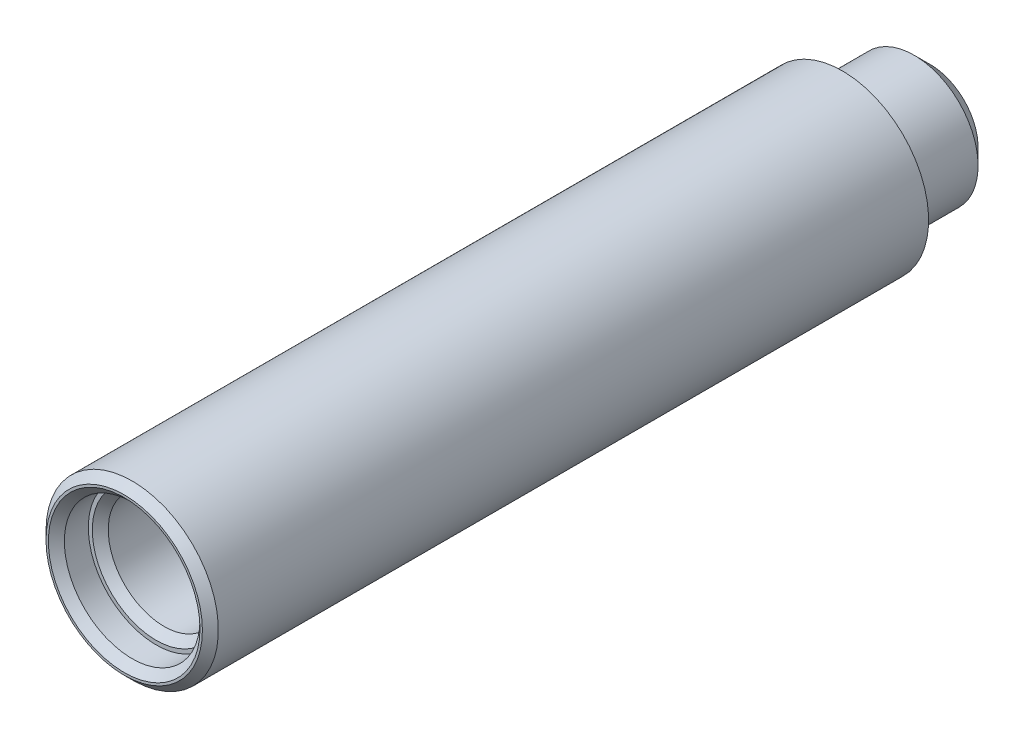
ISO-10303-21;
HEADER;
FILE_DESCRIPTION(('STEP AP214'),'2;1');
FILE_NAME('part.step','',(''),(''),'','','');
FILE_SCHEMA(('AUTOMOTIVE_DESIGN { 1 0 10303 214 1 1 1 1 }'));
ENDSEC;
DATA;
#1=APPLICATION_CONTEXT('core data for automotive mechanical design processes');
#2=APPLICATION_PROTOCOL_DEFINITION('international standard','automotive_design',2000,#1);
#3=PRODUCT_CONTEXT('',#1,'mechanical');
#4=PRODUCT('Part','Part','',(#3));
#5=PRODUCT_RELATED_PRODUCT_CATEGORY('part','',(#4));
#6=PRODUCT_DEFINITION_FORMATION('','',#4);
#7=PRODUCT_DEFINITION_CONTEXT('part definition',#1,'design');
#8=PRODUCT_DEFINITION('design','',#6,#7);
#9=PRODUCT_DEFINITION_SHAPE('','',#8);
#10=(LENGTH_UNIT() NAMED_UNIT(*) SI_UNIT(.MILLI.,.METRE.));
#11=(NAMED_UNIT(*) PLANE_ANGLE_UNIT() SI_UNIT($,.RADIAN.));
#12=(NAMED_UNIT(*) SI_UNIT($,.STERADIAN.) SOLID_ANGLE_UNIT());
#13=UNCERTAINTY_MEASURE_WITH_UNIT(LENGTH_MEASURE(1.E-05),#10,'distance_accuracy_value','');
#14=(GEOMETRIC_REPRESENTATION_CONTEXT(3) GLOBAL_UNCERTAINTY_ASSIGNED_CONTEXT((#13)) GLOBAL_UNIT_ASSIGNED_CONTEXT((#10,
#11,#12)) REPRESENTATION_CONTEXT('',''));
#15=CARTESIAN_POINT('',(0.,0.,0.));
#16=DIRECTION('',(0.,0.,1.));
#17=DIRECTION('',(1.,0.,0.));
#18=AXIS2_PLACEMENT_3D('',#15,#16,#17);
#19=CARTESIAN_POINT('',(0.,0.,0.));
#20=DIRECTION('',(0.,0.,1.));
#21=DIRECTION('',(1.,0.,0.));
#22=AXIS2_PLACEMENT_3D('',#19,#20,#21);
#23=PLANE('',#22);
#24=CARTESIAN_POINT('',(0.,0.,0.));
#25=DIRECTION('',(0.,0.,1.));
#26=DIRECTION('',(1.,0.,0.));
#27=AXIS2_PLACEMENT_3D('',#24,#25,#26);
#28=CIRCLE('',#27,5.4);
#29=CARTESIAN_POINT('',(-5.4,0.,0.));
#30=VERTEX_POINT('',#29);
#31=EDGE_CURVE('E58',#30,#30,#28,.T.);
#32=ORIENTED_EDGE('',*,*,#31,.F.);
#33=EDGE_LOOP('',(#32));
#34=FACE_BOUND('',#33,.T.);
#35=CARTESIAN_POINT('',(0.,0.,0.));
#36=DIRECTION('',(0.,0.,1.));
#37=DIRECTION('',(1.,0.,0.));
#38=AXIS2_PLACEMENT_3D('',#35,#36,#37);
#39=CIRCLE('',#38,3.5);
#40=CARTESIAN_POINT('',(3.5,0.,0.));
#41=VERTEX_POINT('',#40);
#42=EDGE_CURVE('E86',#41,#41,#39,.F.);
#43=ORIENTED_EDGE('',*,*,#42,.F.);
#44=EDGE_LOOP('',(#43));
#45=FACE_BOUND('',#44,.T.);
#46=ADVANCED_FACE('F38',(#34,#45),#23,.F.);
#47=CARTESIAN_POINT('',(0.,0.,45.));
#48=DIRECTION('',(0.,0.,-1.));
#49=DIRECTION('',(-1.,0.,0.));
#50=AXIS2_PLACEMENT_3D('',#47,#48,#49);
#51=CYLINDRICAL_SURFACE('',#50,5.4);
#52=CARTESIAN_POINT('',(0.,0.,44.5));
#53=DIRECTION('',(0.,0.,1.));
#54=DIRECTION('',(1.,0.,0.));
#55=AXIS2_PLACEMENT_3D('',#52,#53,#54);
#56=CIRCLE('',#55,5.4);
#57=CARTESIAN_POINT('',(-5.4,0.,44.5));
#58=VERTEX_POINT('',#57);
#59=EDGE_CURVE('E71',#58,#58,#56,.F.);
#60=CARTESIAN_POINT('',(-5.4,0.,44.5));
#61=CARTESIAN_POINT('',(-5.4,0.,44.0364583333334));
#62=CARTESIAN_POINT('',(-5.4,0.,43.5729166666667));
#63=CARTESIAN_POINT('',(-5.4,0.,42.6458333333334));
#64=CARTESIAN_POINT('',(-5.4,0.,42.1822916666667));
#65=CARTESIAN_POINT('',(-5.4,0.,41.2552083333334));
#66=CARTESIAN_POINT('',(-5.4,0.,40.7916666666667));
#67=CARTESIAN_POINT('',(-5.4,0.,39.8645833333334));
#68=CARTESIAN_POINT('',(-5.4,0.,39.4010416666667));
#69=CARTESIAN_POINT('',(-5.4,0.,38.4739583333334));
#70=CARTESIAN_POINT('',(-5.4,0.,38.0104166666667));
#71=CARTESIAN_POINT('',(-5.4,0.,37.0833333333334));
#72=CARTESIAN_POINT('',(-5.4,0.,36.6197916666667));
#73=CARTESIAN_POINT('',(-5.4,0.,35.6927083333334));
#74=CARTESIAN_POINT('',(-5.4,0.,35.2291666666667));
#75=CARTESIAN_POINT('',(-5.4,0.,34.3020833333334));
#76=CARTESIAN_POINT('',(-5.4,0.,33.8385416666667));
#77=CARTESIAN_POINT('',(-5.4,0.,32.9114583333334));
#78=CARTESIAN_POINT('',(-5.4,0.,32.4479166666667));
#79=CARTESIAN_POINT('',(-5.4,0.,31.5208333333334));
#80=CARTESIAN_POINT('',(-5.4,0.,31.0572916666667));
#81=CARTESIAN_POINT('',(-5.4,0.,30.1302083333334));
#82=CARTESIAN_POINT('',(-5.4,0.,29.6666666666667));
#83=CARTESIAN_POINT('',(-5.4,0.,28.7395833333334));
#84=CARTESIAN_POINT('',(-5.4,0.,28.2760416666667));
#85=CARTESIAN_POINT('',(-5.4,0.,27.3489583333334));
#86=CARTESIAN_POINT('',(-5.4,0.,26.8854166666667));
#87=CARTESIAN_POINT('',(-5.4,0.,25.9583333333334));
#88=CARTESIAN_POINT('',(-5.4,0.,25.4947916666667));
#89=CARTESIAN_POINT('',(-5.4,0.,24.5677083333334));
#90=CARTESIAN_POINT('',(-5.4,0.,24.1041666666667));
#91=CARTESIAN_POINT('',(-5.4,0.,23.1770833333334));
#92=CARTESIAN_POINT('',(-5.4,0.,22.7135416666667));
#93=CARTESIAN_POINT('',(-5.4,0.,21.7864583333334));
#94=CARTESIAN_POINT('',(-5.4,0.,21.3229166666667));
#95=CARTESIAN_POINT('',(-5.4,0.,20.3958333333333));
#96=CARTESIAN_POINT('',(-5.4,0.,19.9322916666667));
#97=CARTESIAN_POINT('',(-5.4,0.,19.0052083333333));
#98=CARTESIAN_POINT('',(-5.4,0.,18.5416666666667));
#99=CARTESIAN_POINT('',(-5.4,0.,17.6145833333333));
#100=CARTESIAN_POINT('',(-5.4,0.,17.1510416666667));
#101=CARTESIAN_POINT('',(-5.4,0.,16.2239583333333));
#102=CARTESIAN_POINT('',(-5.4,0.,15.7604166666667));
#103=CARTESIAN_POINT('',(-5.4,0.,14.8333333333333));
#104=CARTESIAN_POINT('',(-5.4,0.,14.3697916666667));
#105=CARTESIAN_POINT('',(-5.4,0.,13.4427083333333));
#106=CARTESIAN_POINT('',(-5.4,0.,12.9791666666667));
#107=CARTESIAN_POINT('',(-5.4,0.,12.0520833333333));
#108=CARTESIAN_POINT('',(-5.4,0.,11.5885416666667));
#109=CARTESIAN_POINT('',(-5.4,0.,10.6614583333333));
#110=CARTESIAN_POINT('',(-5.4,0.,10.1979166666667));
#111=CARTESIAN_POINT('',(-5.4,0.,9.27083333333334));
#112=CARTESIAN_POINT('',(-5.4,0.,8.80729166666667));
#113=CARTESIAN_POINT('',(-5.4,0.,7.88020833333334));
#114=CARTESIAN_POINT('',(-5.4,0.,7.41666666666668));
#115=CARTESIAN_POINT('',(-5.4,0.,6.48958333333334));
#116=CARTESIAN_POINT('',(-5.4,0.,6.02604166666667));
#117=CARTESIAN_POINT('',(-5.4,0.,5.09895833333334));
#118=CARTESIAN_POINT('',(-5.4,0.,4.63541666666667));
#119=CARTESIAN_POINT('',(-5.4,0.,3.70833333333333));
#120=CARTESIAN_POINT('',(-5.4,0.,3.24479166666667));
#121=CARTESIAN_POINT('',(-5.4,0.,2.31770833333334));
#122=CARTESIAN_POINT('',(-5.4,0.,1.85416666666667));
#123=CARTESIAN_POINT('',(-5.4,0.,0.927083333333331));
#124=CARTESIAN_POINT('',(-5.4,0.,0.463541666666661));
#125=CARTESIAN_POINT('',(-5.4,0.,0.));
#126=B_SPLINE_CURVE_WITH_KNOTS('',3,(#60,#61,#62,#63,#64,#65,#66,#67,#68,#69,#70,#71,#72,#73,
#74,#75,#76,#77,#78,#79,#80,#81,#82,#83,#84,#85,#86,#87,#88,#89,#90,#91,#92,#93,#94,#95,#96,#97,
#98,#99,#100,#101,#102,#103,#104,#105,#106,#107,#108,#109,#110,#111,#112,#113,#114,#115,#116,
#117,#118,#119,#120,#121,#122,#123,#124,#125),.UNSPECIFIED.,.F.,.F.,(4,2,2,2,2,2,2,2,2,2,2,2,2,
2,2,2,2,2,2,2,2,2,2,2,2,2,2,2,2,2,2,2,4),(0.,1.39062500000001,2.78125000000001,4.17187500000001,
5.56250000000001,6.95312500000001,8.34375000000001,9.73437500000001,11.125,12.515625,13.90625,
15.296875,16.6875,18.078125,19.46875,20.859375,22.25,23.640625,25.03125,26.421875,27.8125,
29.203125,30.59375,31.984375,33.375,34.765625,36.15625,37.546875,38.9375,40.328125,41.71875,
43.109375,44.5000000000001),.UNSPECIFIED.);
#127=EDGE_CURVE('BSEAM102',#58,#30,#126,.T.);
#128=ORIENTED_EDGE('',*,*,#59,.T.);
#129=ORIENTED_EDGE('',*,*,#31,.T.);
#130=ORIENTED_EDGE('',*,*,#127,.T.);
#131=ORIENTED_EDGE('',*,*,#127,.F.);
#132=EDGE_LOOP('',(#128,#130,#129,#131));
#133=FACE_BOUND('',#132,.T.);
#134=ADVANCED_FACE('F102',(#133),#51,.T.);
#135=CARTESIAN_POINT('',(0.,0.,45.));
#136=DIRECTION('',(0.,0.,1.));
#137=DIRECTION('',(1.,0.,0.));
#138=AXIS2_PLACEMENT_3D('',#135,#136,#137);
#139=PLANE('',#138);
#140=CARTESIAN_POINT('',(0.,0.,45.));
#141=DIRECTION('',(0.,0.,1.));
#142=DIRECTION('',(1.,0.,0.));
#143=AXIS2_PLACEMENT_3D('',#140,#141,#142);
#144=CIRCLE('',#143,4.75);
#145=CARTESIAN_POINT('',(4.74999999999999,0.,45.));
#146=VERTEX_POINT('',#145);
#147=EDGE_CURVE('E77',#146,#146,#144,.F.);
#148=ORIENTED_EDGE('',*,*,#147,.T.);
#149=EDGE_LOOP('',(#148));
#150=FACE_BOUND('',#149,.T.);
#151=CARTESIAN_POINT('',(0.,0.,45.));
#152=DIRECTION('',(0.,0.,1.));
#153=DIRECTION('',(1.,0.,0.));
#154=AXIS2_PLACEMENT_3D('',#151,#152,#153);
#155=CIRCLE('',#154,4.90000000000004);
#156=CARTESIAN_POINT('',(4.90000000000004,0.,45.));
#157=VERTEX_POINT('',#156);
#158=EDGE_CURVE('E62',#157,#157,#155,.T.);
#159=ORIENTED_EDGE('',*,*,#158,.T.);
#160=EDGE_LOOP('',(#159));
#161=FACE_BOUND('',#160,.T.);
#162=ADVANCED_FACE('F108',(#150,#161),#139,.T.);
#163=CARTESIAN_POINT('',(0.,0.,45.));
#164=DIRECTION('',(0.,0.,-1.));
#165=DIRECTION('',(-1.,0.,0.));
#166=AXIS2_PLACEMENT_3D('',#163,#164,#165);
#167=CONICAL_SURFACE('',#166,4.90000000000004,0.785398163397454);
#168=ORIENTED_EDGE('',*,*,#59,.F.);
#169=EDGE_LOOP('',(#168));
#170=FACE_BOUND('',#169,.T.);
#171=ORIENTED_EDGE('',*,*,#158,.F.);
#172=EDGE_LOOP('',(#171));
#173=FACE_BOUND('',#172,.T.);
#174=ADVANCED_FACE('F120',(#170,#173),#167,.T.);
#175=CARTESIAN_POINT('',(0.,0.,43.));
#176=DIRECTION('',(0.,0.,1.));
#177=DIRECTION('',(1.,0.,0.));
#178=AXIS2_PLACEMENT_3D('',#175,#176,#177);
#179=PLANE('',#178);
#180=CARTESIAN_POINT('',(0.,0.,43.));
#181=DIRECTION('',(0.,0.,1.));
#182=DIRECTION('',(1.,0.,0.));
#183=AXIS2_PLACEMENT_3D('',#180,#181,#182);
#184=CIRCLE('',#183,3.99999999999998);
#185=CARTESIAN_POINT('',(3.99999999999998,0.,43.));
#186=VERTEX_POINT('',#185);
#187=EDGE_CURVE('E80',#186,#186,#184,.F.);
#188=ORIENTED_EDGE('',*,*,#187,.T.);
#189=EDGE_LOOP('',(#188));
#190=FACE_BOUND('',#189,.T.);
#191=CARTESIAN_POINT('',(0.,0.,43.));
#192=DIRECTION('',(0.,0.,1.));
#193=DIRECTION('',(1.,0.,0.));
#194=AXIS2_PLACEMENT_3D('',#191,#192,#193);
#195=CIRCLE('',#194,4.25);
#196=CARTESIAN_POINT('',(4.25,0.,43.));
#197=VERTEX_POINT('',#196);
#198=EDGE_CURVE('E59',#197,#197,#195,.T.);
#199=ORIENTED_EDGE('',*,*,#198,.T.);
#200=EDGE_LOOP('',(#199));
#201=FACE_BOUND('',#200,.T.);
#202=ADVANCED_FACE('F117',(#190,#201),#179,.T.);
#203=CARTESIAN_POINT('',(0.,0.,43.));
#204=DIRECTION('',(0.,0.,1.));
#205=DIRECTION('',(1.,0.,0.));
#206=AXIS2_PLACEMENT_3D('',#203,#204,#205);
#207=CYLINDRICAL_SURFACE('',#206,4.25);
#208=CARTESIAN_POINT('',(0.,0.,44.5));
#209=DIRECTION('',(0.,0.,1.));
#210=DIRECTION('',(1.,0.,0.));
#211=AXIS2_PLACEMENT_3D('',#208,#209,#210);
#212=CIRCLE('',#211,4.25);
#213=CARTESIAN_POINT('',(4.25,0.,44.5));
#214=VERTEX_POINT('',#213);
#215=EDGE_CURVE('E74',#214,#214,#212,.T.);
#216=ORIENTED_EDGE('',*,*,#215,.T.);
#217=EDGE_LOOP('',(#216));
#218=FACE_BOUND('',#217,.T.);
#219=ORIENTED_EDGE('',*,*,#198,.F.);
#220=EDGE_LOOP('',(#219));
#221=FACE_BOUND('',#220,.T.);
#222=ADVANCED_FACE('F52',(#218,#221),#207,.F.);
#223=CARTESIAN_POINT('',(0.,0.,32.));
#224=DIRECTION('',(0.,0.,1.));
#225=DIRECTION('',(1.,0.,0.));
#226=AXIS2_PLACEMENT_3D('',#223,#224,#225);
#227=CONICAL_SURFACE('',#226,3.5,1.02974425867665);
#228=CARTESIAN_POINT('',(0.,0.,29.8969878334035));
#229=VERTEX_POINT('',#228);
#230=VERTEX_LOOP('',#229);
#231=FACE_BOUND('',#230,.T.);
#232=CARTESIAN_POINT('',(0.,0.,32.));
#233=DIRECTION('',(0.,0.,1.));
#234=DIRECTION('',(1.,0.,0.));
#235=AXIS2_PLACEMENT_3D('',#232,#233,#234);
#236=CIRCLE('',#235,3.5);
#237=CARTESIAN_POINT('',(3.5,0.,32.));
#238=VERTEX_POINT('',#237);
#239=EDGE_CURVE('E56',#238,#238,#236,.T.);
#240=ORIENTED_EDGE('',*,*,#239,.T.);
#241=EDGE_LOOP('',(#240));
#242=FACE_BOUND('',#241,.T.);
#243=ADVANCED_FACE('F48',(#231,#242),#227,.F.);
#244=CARTESIAN_POINT('',(0.,0.,45.));
#245=DIRECTION('',(0.,0.,1.));
#246=DIRECTION('',(1.,0.,0.));
#247=AXIS2_PLACEMENT_3D('',#244,#245,#246);
#248=CYLINDRICAL_SURFACE('',#247,3.5);
#249=CARTESIAN_POINT('',(0.,0.,42.5));
#250=DIRECTION('',(0.,0.,1.));
#251=DIRECTION('',(1.,0.,0.));
#252=AXIS2_PLACEMENT_3D('',#249,#250,#251);
#253=CIRCLE('',#252,3.5);
#254=CARTESIAN_POINT('',(3.5,0.,42.5));
#255=VERTEX_POINT('',#254);
#256=EDGE_CURVE('E83',#255,#255,#253,.T.);
#257=ORIENTED_EDGE('',*,*,#256,.T.);
#258=EDGE_LOOP('',(#257));
#259=FACE_BOUND('',#258,.T.);
#260=ORIENTED_EDGE('',*,*,#239,.F.);
#261=EDGE_LOOP('',(#260));
#262=FACE_BOUND('',#261,.T.);
#263=ADVANCED_FACE('F51',(#259,#262),#248,.F.);
#264=CARTESIAN_POINT('',(0.,0.,44.5));
#265=DIRECTION('',(0.,0.,1.));
#266=DIRECTION('',(1.,0.,0.));
#267=AXIS2_PLACEMENT_3D('',#264,#265,#266);
#268=CONICAL_SURFACE('',#267,4.25,0.785398163397452);
#269=ORIENTED_EDGE('',*,*,#147,.F.);
#270=EDGE_LOOP('',(#269));
#271=FACE_BOUND('',#270,.T.);
#272=ORIENTED_EDGE('',*,*,#215,.F.);
#273=EDGE_LOOP('',(#272));
#274=FACE_BOUND('',#273,.T.);
#275=ADVANCED_FACE('F126',(#271,#274),#268,.F.);
#276=CARTESIAN_POINT('',(0.,0.,43.));
#277=DIRECTION('',(0.,0.,1.));
#278=DIRECTION('',(1.,0.,0.));
#279=AXIS2_PLACEMENT_3D('',#276,#277,#278);
#280=CONICAL_SURFACE('',#279,3.99999999999998,0.785398163397453);
#281=ORIENTED_EDGE('',*,*,#256,.F.);
#282=EDGE_LOOP('',(#281));
#283=FACE_BOUND('',#282,.T.);
#284=ORIENTED_EDGE('',*,*,#187,.F.);
#285=EDGE_LOOP('',(#284));
#286=FACE_BOUND('',#285,.T.);
#287=ADVANCED_FACE('F136',(#283,#286),#280,.F.);
#288=CARTESIAN_POINT('',(0.,0.,-0.5));
#289=DIRECTION('',(0.,0.,1.));
#290=DIRECTION('',(1.,0.,0.));
#291=AXIS2_PLACEMENT_3D('',#288,#289,#290);
#292=CYLINDRICAL_SURFACE('',#291,3.5);
#293=CARTESIAN_POINT('',(0.,0.,-0.5));
#294=DIRECTION('',(0.,0.,-1.));
#295=DIRECTION('',(-1.,0.,0.));
#296=AXIS2_PLACEMENT_3D('',#293,#294,#295);
#297=CIRCLE('',#296,3.5);
#298=CARTESIAN_POINT('',(-3.5,0.,-0.5));
#299=VERTEX_POINT('',#298);
#300=EDGE_CURVE('E65',#299,#299,#297,.T.);
#301=ORIENTED_EDGE('',*,*,#300,.F.);
#302=EDGE_LOOP('',(#301));
#303=FACE_BOUND('',#302,.T.);
#304=ORIENTED_EDGE('',*,*,#42,.T.);
#305=EDGE_LOOP('',(#304));
#306=FACE_BOUND('',#305,.T.);
#307=ADVANCED_FACE('F115',(#303,#306),#292,.T.);
#308=CARTESIAN_POINT('',(0.,0.,-0.5));
#309=DIRECTION('',(0.,0.,-1.));
#310=DIRECTION('',(-1.,0.,0.));
#311=AXIS2_PLACEMENT_3D('',#308,#309,#310);
#312=PLANE('',#311);
#313=CARTESIAN_POINT('',(0.,0.,-0.5));
#314=DIRECTION('',(0.,0.,-1.));
#315=DIRECTION('',(-1.,0.,0.));
#316=AXIS2_PLACEMENT_3D('',#313,#314,#315);
#317=CIRCLE('',#316,4.);
#318=CARTESIAN_POINT('',(-4.,0.,-0.5));
#319=VERTEX_POINT('',#318);
#320=EDGE_CURVE('E161',#319,#319,#317,.T.);
#321=ORIENTED_EDGE('',*,*,#320,.F.);
#322=EDGE_LOOP('',(#321));
#323=FACE_BOUND('',#322,.T.);
#324=ORIENTED_EDGE('',*,*,#300,.T.);
#325=EDGE_LOOP('',(#324));
#326=FACE_BOUND('',#325,.T.);
#327=ADVANCED_FACE('F143',(#323,#326),#312,.F.);
#328=CARTESIAN_POINT('',(0.,0.,-5.5));
#329=DIRECTION('',(0.,0.,1.));
#330=DIRECTION('',(1.,0.,0.));
#331=AXIS2_PLACEMENT_3D('',#328,#329,#330);
#332=CYLINDRICAL_SURFACE('',#331,4.);
#333=CARTESIAN_POINT('',(0.,0.,-4.5));
#334=DIRECTION('',(0.,0.,-1.));
#335=DIRECTION('',(-1.,0.,0.));
#336=AXIS2_PLACEMENT_3D('',#333,#334,#335);
#337=CIRCLE('',#336,4.);
#338=CARTESIAN_POINT('',(-4.,0.,-4.5));
#339=VERTEX_POINT('',#338);
#340=EDGE_CURVE('E11',#339,#339,#337,.F.);
#341=ORIENTED_EDGE('',*,*,#340,.T.);
#342=EDGE_LOOP('',(#341));
#343=FACE_BOUND('',#342,.T.);
#344=ORIENTED_EDGE('',*,*,#320,.T.);
#345=EDGE_LOOP('',(#344));
#346=FACE_BOUND('',#345,.T.);
#347=ADVANCED_FACE('F98',(#343,#346),#332,.T.);
#348=CARTESIAN_POINT('',(0.,0.,-5.5));
#349=DIRECTION('',(0.,0.,-1.));
#350=DIRECTION('',(-1.,0.,0.));
#351=AXIS2_PLACEMENT_3D('',#348,#349,#350);
#352=PLANE('',#351);
#353=CARTESIAN_POINT('',(0.,0.,-5.5));
#354=DIRECTION('',(0.,0.,-1.));
#355=DIRECTION('',(-1.,0.,0.));
#356=AXIS2_PLACEMENT_3D('',#353,#354,#355);
#357=CIRCLE('',#356,3.);
#358=CARTESIAN_POINT('',(-3.,0.,-5.5));
#359=VERTEX_POINT('',#358);
#360=EDGE_CURVE('E45',#359,#359,#357,.T.);
#361=ORIENTED_EDGE('',*,*,#360,.T.);
#362=EDGE_LOOP('',(#361));
#363=FACE_BOUND('',#362,.T.);
#364=ADVANCED_FACE('F91',(#363),#352,.T.);
#365=CARTESIAN_POINT('',(0.,0.,-5.5));
#366=DIRECTION('',(0.,0.,1.));
#367=DIRECTION('',(1.,0.,0.));
#368=AXIS2_PLACEMENT_3D('',#365,#366,#367);
#369=CONICAL_SURFACE('',#368,3.,0.785398163397448);
#370=ORIENTED_EDGE('',*,*,#340,.F.);
#371=EDGE_LOOP('',(#370));
#372=FACE_BOUND('',#371,.T.);
#373=ORIENTED_EDGE('',*,*,#360,.F.);
#374=EDGE_LOOP('',(#373));
#375=FACE_BOUND('',#374,.T.);
#376=ADVANCED_FACE('F40',(#372,#375),#369,.T.);
#377=CLOSED_SHELL('',(#46,#134,#162,#174,#202,#222,#243,#263,#275,#287,#307,#327,#347,#364,#376));
#378=MANIFOLD_SOLID_BREP('B2',#377);
#379=ADVANCED_BREP_SHAPE_REPRESENTATION('',(#18,#378),#14);
#380=SHAPE_DEFINITION_REPRESENTATION(#9,#379);
ENDSEC;
END-ISO-10303-21;
